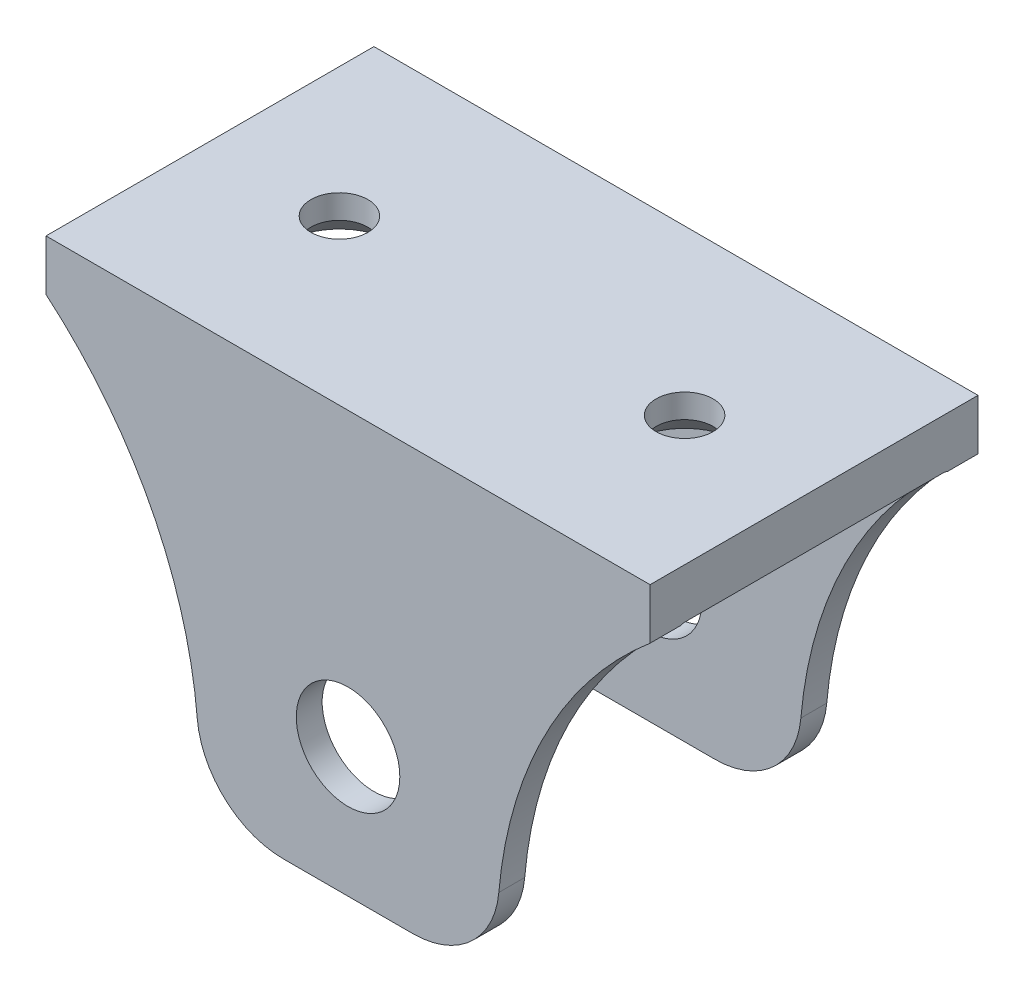
ISO-10303-21;
HEADER;
FILE_DESCRIPTION(('STEP AP214'),'2;1');
FILE_NAME('part.step','',(''),(''),'','','');
FILE_SCHEMA(('AUTOMOTIVE_DESIGN { 1 0 10303 214 1 1 1 1 }'));
ENDSEC;
DATA;
#1=APPLICATION_CONTEXT('core data for automotive mechanical design processes');
#2=APPLICATION_PROTOCOL_DEFINITION('international standard','automotive_design',2000,#1);
#3=PRODUCT_CONTEXT('',#1,'mechanical');
#4=PRODUCT('Part','Part','',(#3));
#5=PRODUCT_RELATED_PRODUCT_CATEGORY('part','',(#4));
#6=PRODUCT_DEFINITION_FORMATION('','',#4);
#7=PRODUCT_DEFINITION_CONTEXT('part definition',#1,'design');
#8=PRODUCT_DEFINITION('design','',#6,#7);
#9=PRODUCT_DEFINITION_SHAPE('','',#8);
#10=(LENGTH_UNIT() NAMED_UNIT(*) SI_UNIT(.MILLI.,.METRE.));
#11=(NAMED_UNIT(*) PLANE_ANGLE_UNIT() SI_UNIT($,.RADIAN.));
#12=(NAMED_UNIT(*) SI_UNIT($,.STERADIAN.) SOLID_ANGLE_UNIT());
#13=UNCERTAINTY_MEASURE_WITH_UNIT(LENGTH_MEASURE(1.E-05),#10,'distance_accuracy_value','');
#14=(GEOMETRIC_REPRESENTATION_CONTEXT(3) GLOBAL_UNCERTAINTY_ASSIGNED_CONTEXT((#13)) GLOBAL_UNIT_ASSIGNED_CONTEXT((#10,
#11,#12)) REPRESENTATION_CONTEXT('',''));
#15=CARTESIAN_POINT('',(0.,0.,0.));
#16=DIRECTION('',(0.,0.,1.));
#17=DIRECTION('',(1.,0.,0.));
#18=AXIS2_PLACEMENT_3D('',#15,#16,#17);
#19=CARTESIAN_POINT('',(-32.2779552679648,4.7069278027708,38.));
#20=DIRECTION('',(0.,0.,-1.));
#21=DIRECTION('',(-1.,0.,0.));
#22=AXIS2_PLACEMENT_3D('',#19,#20,#21);
#23=CYLINDRICAL_SURFACE('',#22,50.);
#24=DIRECTION('',(0.,0.,-1.));
#25=VECTOR('',#24,1.);
#26=CARTESIAN_POINT('',(0.,42.8924434300249,38.));
#27=LINE('',#26,#25);
#28=CARTESIAN_POINT('',(0.,42.8924434300249,38.));
#29=VERTEX_POINT('',#28);
#30=CARTESIAN_POINT('',(0.,42.8924434300249,34.4511593113363));
#31=VERTEX_POINT('',#30);
#32=EDGE_CURVE('E201',#29,#31,#27,.T.);
#33=ORIENTED_EDGE('',*,*,#32,.T.);
#34=CARTESIAN_POINT('',(0.,42.8924434300249,34.4511593113363));
#35=CARTESIAN_POINT('',(0.0165737755404564,42.8784340684061,34.4788576922844));
#36=CARTESIAN_POINT('',(0.0342804237961546,42.8634479296618,34.5053146071971));
#37=CARTESIAN_POINT('',(0.0715275687075985,42.8318743436861,34.555761443307));
#38=CARTESIAN_POINT('',(0.0910634553210315,42.8152909190579,34.579757263009));
#39=CARTESIAN_POINT('',(0.151456199566266,42.7639381509381,34.6477691653998));
#40=CARTESIAN_POINT('',(0.194478777004276,42.7272451192806,34.6884127674672));
#41=CARTESIAN_POINT('',(0.301753594752499,42.6354039331985,34.7756996312057));
#42=CARTESIAN_POINT('',(0.367726578397464,42.578651736762,34.8184694778107));
#43=CARTESIAN_POINT('',(0.504003930345722,42.4607537076925,34.8902249155182));
#44=CARTESIAN_POINT('',(0.574339239835926,42.399575812586,34.9190952240054));
#45=CARTESIAN_POINT('',(0.708788449071322,42.2819432439424,34.9612213949925));
#46=CARTESIAN_POINT('',(0.772695222897111,42.2257473422288,34.975884207073));
#47=CARTESIAN_POINT('',(0.868496783026503,42.1410633955054,34.9904070189195));
#48=CARTESIAN_POINT('',(0.900207937336673,42.1129605477587,34.9940030076944));
#49=CARTESIAN_POINT('',(0.963656182732306,42.0565873804818,34.9987974089236));
#50=CARTESIAN_POINT('',(0.995393270380941,42.0283170807641,34.9999960995532));
#51=CARTESIAN_POINT('',(1.02710089611114,42.,35.));
#52=B_SPLINE_CURVE_WITH_KNOTS('',3,(#34,#35,#36,#37,#38,#39,#40,#41,#42,#43,#44,#45,#46,#47,#48,
#49,#50,#51),.UNSPECIFIED.,.F.,.F.,(4,2,2,2,2,2,2,2,4),(0.,0.105424627320015,0.210590369885622,
0.418610866371283,0.708012924422764,0.999775608701713,1.25820941884816,1.38572347951947,
1.51322274297915),.UNSPECIFIED.);
#53=CARTESIAN_POINT('',(1.02710089611114,42.,35.));
#54=VERTEX_POINT('',#53);
#55=EDGE_CURVE('E218',#31,#54,#52,.T.);
#56=ORIENTED_EDGE('',*,*,#55,.T.);
#57=CARTESIAN_POINT('',(-32.2779552679648,4.7069278027708,35.));
#58=DIRECTION('',(0.,0.,1.));
#59=DIRECTION('',(1.,0.,0.));
#60=AXIS2_PLACEMENT_3D('',#57,#58,#59);
#61=CIRCLE('',#60,50.);
#62=CARTESIAN_POINT('',(17.5271049021829,9.1178213004618,35.));
#63=VERTEX_POINT('',#62);
#64=EDGE_CURVE('E288',#54,#63,#61,.F.);
#65=ORIENTED_EDGE('',*,*,#64,.T.);
#66=DIRECTION('',(0.,0.,-1.));
#67=VECTOR('',#66,1.);
#68=CARTESIAN_POINT('',(17.5271049021829,9.1178213004618,38.));
#69=LINE('',#68,#67);
#70=CARTESIAN_POINT('',(17.5271049021829,9.1178213004618,38.));
#71=VERTEX_POINT('',#70);
#72=EDGE_CURVE('E198',#71,#63,#69,.T.);
#73=ORIENTED_EDGE('',*,*,#72,.F.);
#74=CARTESIAN_POINT('',(-32.2779552679648,4.7069278027708,38.));
#75=DIRECTION('',(0.,0.,1.));
#76=DIRECTION('',(1.,0.,0.));
#77=AXIS2_PLACEMENT_3D('',#74,#75,#76);
#78=CIRCLE('',#77,50.);
#79=EDGE_CURVE('E272',#29,#71,#78,.F.);
#80=ORIENTED_EDGE('',*,*,#79,.F.);
#81=EDGE_LOOP('',(#33,#56,#65,#73,#80));
#82=FACE_BOUND('',#81,.T.);
#83=ADVANCED_FACE('F38',(#82),#23,.F.);
#84=CARTESIAN_POINT('',(27.4881169362124,10.,38.));
#85=DIRECTION('',(0.,0.,-1.));
#86=DIRECTION('',(-1.,0.,0.));
#87=AXIS2_PLACEMENT_3D('',#84,#85,#86);
#88=CYLINDRICAL_SURFACE('',#87,10.);
#89=CARTESIAN_POINT('',(27.4881169362124,10.,35.));
#90=DIRECTION('',(0.,0.,1.));
#91=DIRECTION('',(1.,0.,0.));
#92=AXIS2_PLACEMENT_3D('',#89,#90,#91);
#93=CIRCLE('',#92,10.);
#94=CARTESIAN_POINT('',(27.4881169362124,0.,35.));
#95=VERTEX_POINT('',#94);
#96=EDGE_CURVE('E298',#95,#63,#93,.F.);
#97=ORIENTED_EDGE('',*,*,#96,.F.);
#98=DIRECTION('',(0.,0.,-1.));
#99=VECTOR('',#98,1.);
#100=CARTESIAN_POINT('',(27.4881169362124,0.,38.));
#101=LINE('',#100,#99);
#102=CARTESIAN_POINT('',(27.4881169362124,0.,38.));
#103=VERTEX_POINT('',#102);
#104=EDGE_CURVE('E189',#103,#95,#101,.T.);
#105=ORIENTED_EDGE('',*,*,#104,.F.);
#106=CARTESIAN_POINT('',(27.4881169362124,10.,38.));
#107=DIRECTION('',(0.,0.,1.));
#108=DIRECTION('',(1.,0.,0.));
#109=AXIS2_PLACEMENT_3D('',#106,#107,#108);
#110=CIRCLE('',#109,10.);
#111=EDGE_CURVE('E317',#103,#71,#110,.F.);
#112=ORIENTED_EDGE('',*,*,#111,.T.);
#113=ORIENTED_EDGE('',*,*,#72,.T.);
#114=EDGE_LOOP('',(#97,#105,#112,#113));
#115=FACE_BOUND('',#114,.T.);
#116=ADVANCED_FACE('F261',(#115),#88,.T.);
#117=CARTESIAN_POINT('',(0.,0.,38.));
#118=DIRECTION('',(0.,1.,0.));
#119=DIRECTION('',(0.,0.,1.));
#120=AXIS2_PLACEMENT_3D('',#117,#118,#119);
#121=PLANE('',#120);
#122=ORIENTED_EDGE('',*,*,#104,.T.);
#123=DIRECTION('',(-1.,0.,0.));
#124=VECTOR('',#123,1.);
#125=CARTESIAN_POINT('',(0.,0.,35.));
#126=LINE('',#125,#124);
#127=CARTESIAN_POINT('',(42.5118830637876,0.,35.));
#128=VERTEX_POINT('',#127);
#129=EDGE_CURVE('E182',#128,#95,#126,.T.);
#130=ORIENTED_EDGE('',*,*,#129,.F.);
#131=DIRECTION('',(0.,0.,-1.));
#132=VECTOR('',#131,1.);
#133=CARTESIAN_POINT('',(42.5118830637876,0.,38.));
#134=LINE('',#133,#132);
#135=CARTESIAN_POINT('',(42.5118830637876,0.,38.));
#136=VERTEX_POINT('',#135);
#137=EDGE_CURVE('E190',#136,#128,#134,.T.);
#138=ORIENTED_EDGE('',*,*,#137,.F.);
#139=DIRECTION('',(1.,0.,0.));
#140=VECTOR('',#139,1.);
#141=CARTESIAN_POINT('',(0.,0.,38.));
#142=LINE('',#141,#140);
#143=EDGE_CURVE('E320',#103,#136,#142,.T.);
#144=ORIENTED_EDGE('',*,*,#143,.F.);
#145=EDGE_LOOP('',(#122,#130,#138,#144));
#146=FACE_BOUND('',#145,.T.);
#147=ADVANCED_FACE('F266',(#146),#121,.F.);
#148=CARTESIAN_POINT('',(42.5118830637876,10.,38.));
#149=DIRECTION('',(0.,0.,-1.));
#150=DIRECTION('',(-1.,0.,0.));
#151=AXIS2_PLACEMENT_3D('',#148,#149,#150);
#152=CYLINDRICAL_SURFACE('',#151,10.);
#153=ORIENTED_EDGE('',*,*,#137,.T.);
#154=CARTESIAN_POINT('',(42.5118830637876,10.,35.));
#155=DIRECTION('',(0.,0.,1.));
#156=DIRECTION('',(1.,0.,0.));
#157=AXIS2_PLACEMENT_3D('',#154,#155,#156);
#158=CIRCLE('',#157,10.);
#159=CARTESIAN_POINT('',(52.4728950978171,9.1178213004618,35.));
#160=VERTEX_POINT('',#159);
#161=EDGE_CURVE('E295',#128,#160,#158,.T.);
#162=ORIENTED_EDGE('',*,*,#161,.T.);
#163=DIRECTION('',(0.,0.,-1.));
#164=VECTOR('',#163,1.);
#165=CARTESIAN_POINT('',(52.4728950978171,9.1178213004618,38.));
#166=LINE('',#165,#164);
#167=CARTESIAN_POINT('',(52.4728950978171,9.1178213004618,38.));
#168=VERTEX_POINT('',#167);
#169=EDGE_CURVE('E294',#168,#160,#166,.T.);
#170=ORIENTED_EDGE('',*,*,#169,.F.);
#171=CARTESIAN_POINT('',(42.5118830637876,10.,38.));
#172=DIRECTION('',(0.,0.,1.));
#173=DIRECTION('',(1.,0.,0.));
#174=AXIS2_PLACEMENT_3D('',#171,#172,#173);
#175=CIRCLE('',#174,10.);
#176=EDGE_CURVE('E323',#136,#168,#175,.T.);
#177=ORIENTED_EDGE('',*,*,#176,.F.);
#178=EDGE_LOOP('',(#153,#162,#170,#177));
#179=FACE_BOUND('',#178,.T.);
#180=ADVANCED_FACE('F397',(#179),#152,.T.);
#181=CARTESIAN_POINT('',(102.277955267965,4.70692780277081,38.));
#182=DIRECTION('',(0.,0.,-1.));
#183=DIRECTION('',(-1.,0.,0.));
#184=AXIS2_PLACEMENT_3D('',#181,#182,#183);
#185=CYLINDRICAL_SURFACE('',#184,50.);
#186=CARTESIAN_POINT('',(102.277955267965,4.70692780277081,35.));
#187=DIRECTION('',(0.,0.,1.));
#188=DIRECTION('',(1.,0.,0.));
#189=AXIS2_PLACEMENT_3D('',#186,#187,#188);
#190=CIRCLE('',#189,50.);
#191=CARTESIAN_POINT('',(68.9728991038889,42.,35.));
#192=VERTEX_POINT('',#191);
#193=EDGE_CURVE('E285',#192,#160,#190,.T.);
#194=ORIENTED_EDGE('',*,*,#193,.F.);
#195=CARTESIAN_POINT('',(68.9728991038889,42.,35.));
#196=CARTESIAN_POINT('',(69.0189328627661,42.0411125246596,34.9999822866833));
#197=CARTESIAN_POINT('',(69.0650482729012,42.0821418144975,34.9974636533273));
#198=CARTESIAN_POINT('',(69.1571944097174,42.1638226016345,34.9873541076251));
#199=CARTESIAN_POINT('',(69.2032248651741,42.2044733510247,34.9797547063408));
#200=CARTESIAN_POINT('',(69.2956668569454,42.2858117580748,34.9592195203912));
#201=CARTESIAN_POINT('',(69.342069010497,42.3264854351228,34.9461850645673));
#202=CARTESIAN_POINT('',(69.4339040569988,42.4066892502752,34.9145822186454));
#203=CARTESIAN_POINT('',(69.4793377200552,42.4462203065861,34.8960184156655));
#204=CARTESIAN_POINT('',(69.5792232218089,42.5328216169678,34.8479959253264));
#205=CARTESIAN_POINT('',(69.6332996518212,42.57949336418,34.817004694615));
#206=CARTESIAN_POINT('',(69.737396348496,42.6689704785598,34.7454735548813));
#207=CARTESIAN_POINT('',(69.7874474758785,42.7118056224167,34.7050179831085));
#208=CARTESIAN_POINT('',(69.8651785822598,42.7780917740498,34.6293968752963));
#209=CARTESIAN_POINT('',(69.894552815272,42.8030762540724,34.5973436014197));
#210=CARTESIAN_POINT('',(69.9500605045597,42.8501918179988,34.5281361141865));
#211=CARTESIAN_POINT('',(69.9761654788963,42.8722978833158,34.4909423114399));
#212=CARTESIAN_POINT('',(70.,42.8924434300249,34.4511593113363));
#213=B_SPLINE_CURVE_WITH_KNOTS('',3,(#195,#196,#197,#198,#199,#200,#201,#202,#203,#204,#205,
#206,#207,#208,#209,#210,#211,#212),.UNSPECIFIED.,.F.,.F.,(4,2,2,2,2,2,2,2,4),(0.,
0.185117557812076,0.370545185233216,0.559496791985733,0.748292079981396,0.981233006295467,
1.21217233881067,1.36220305705791,1.51346130414057),.UNSPECIFIED.);
#214=CARTESIAN_POINT('',(70.,42.8924434300249,34.4511593113363));
#215=VERTEX_POINT('',#214);
#216=EDGE_CURVE('E225',#192,#215,#213,.T.);
#217=ORIENTED_EDGE('',*,*,#216,.T.);
#218=DIRECTION('',(0.,0.,-1.));
#219=VECTOR('',#218,1.);
#220=CARTESIAN_POINT('',(70.,42.8924434300249,38.));
#221=LINE('',#220,#219);
#222=CARTESIAN_POINT('',(70.,42.8924434300249,38.));
#223=VERTEX_POINT('',#222);
#224=EDGE_CURVE('E352',#223,#215,#221,.T.);
#225=ORIENTED_EDGE('',*,*,#224,.F.);
#226=CARTESIAN_POINT('',(102.277955267965,4.70692780277081,38.));
#227=DIRECTION('',(0.,0.,1.));
#228=DIRECTION('',(1.,0.,0.));
#229=AXIS2_PLACEMENT_3D('',#226,#227,#228);
#230=CIRCLE('',#229,50.);
#231=EDGE_CURVE('E325',#223,#168,#230,.T.);
#232=ORIENTED_EDGE('',*,*,#231,.T.);
#233=ORIENTED_EDGE('',*,*,#169,.T.);
#234=EDGE_LOOP('',(#194,#217,#225,#232,#233));
#235=FACE_BOUND('',#234,.T.);
#236=ADVANCED_FACE('F291',(#235),#185,.F.);
#237=CARTESIAN_POINT('',(35.,15.,38.));
#238=DIRECTION('',(0.,0.,-1.));
#239=DIRECTION('',(-1.,0.,0.));
#240=AXIS2_PLACEMENT_3D('',#237,#238,#239);
#241=CYLINDRICAL_SURFACE('',#240,5.99999999999999);
#242=CARTESIAN_POINT('',(35.,15.,35.));
#243=DIRECTION('',(0.,0.,1.));
#244=DIRECTION('',(1.,0.,0.));
#245=AXIS2_PLACEMENT_3D('',#242,#243,#244);
#246=CIRCLE('',#245,5.99999999999999);
#247=CARTESIAN_POINT('',(41.,15.,35.));
#248=VERTEX_POINT('',#247);
#249=EDGE_CURVE('E296',#248,#248,#246,.T.);
#250=ORIENTED_EDGE('',*,*,#249,.F.);
#251=EDGE_LOOP('',(#250));
#252=FACE_BOUND('',#251,.T.);
#253=CARTESIAN_POINT('',(35.,15.,38.));
#254=DIRECTION('',(0.,0.,1.));
#255=DIRECTION('',(1.,0.,0.));
#256=AXIS2_PLACEMENT_3D('',#253,#254,#255);
#257=CIRCLE('',#256,5.99999999999999);
#258=CARTESIAN_POINT('',(41.,15.,38.));
#259=VERTEX_POINT('',#258);
#260=EDGE_CURVE('E307',#259,#259,#257,.T.);
#261=ORIENTED_EDGE('',*,*,#260,.T.);
#262=EDGE_LOOP('',(#261));
#263=FACE_BOUND('',#262,.T.);
#264=ADVANCED_FACE('F249',(#252,#263),#241,.F.);
#265=CARTESIAN_POINT('',(0.,48.7686408812628,38.));
#266=DIRECTION('',(0.,1.,0.));
#267=DIRECTION('',(-1.,0.,0.));
#268=AXIS2_PLACEMENT_3D('',#265,#266,#267);
#269=PLANE('',#268);
#270=CARTESIAN_POINT('',(15.,48.7686408812628,19.));
#271=DIRECTION('',(0.,-1.,0.));
#272=DIRECTION('',(0.,0.,-1.));
#273=AXIS2_PLACEMENT_3D('',#270,#271,#272);
#274=CIRCLE('',#273,3.3);
#275=CARTESIAN_POINT('',(15.,48.7686408812628,15.7));
#276=VERTEX_POINT('',#275);
#277=EDGE_CURVE('E634',#276,#276,#274,.T.);
#278=ORIENTED_EDGE('',*,*,#277,.T.);
#279=EDGE_LOOP('',(#278));
#280=FACE_BOUND('',#279,.T.);
#281=CARTESIAN_POINT('',(55.,48.7686408812628,18.9999987775148));
#282=DIRECTION('',(0.,-1.,0.));
#283=DIRECTION('',(0.,0.,-1.));
#284=AXIS2_PLACEMENT_3D('',#281,#282,#283);
#285=CIRCLE('',#284,3.3);
#286=CARTESIAN_POINT('',(55.,48.7686408812628,15.6999987775148));
#287=VERTEX_POINT('',#286);
#288=EDGE_CURVE('E183',#287,#287,#285,.T.);
#289=ORIENTED_EDGE('',*,*,#288,.T.);
#290=EDGE_LOOP('',(#289));
#291=FACE_BOUND('',#290,.T.);
#292=DIRECTION('',(1.,0.,0.));
#293=VECTOR('',#292,1.);
#294=CARTESIAN_POINT('',(0.,48.7686408812628,0.));
#295=LINE('',#294,#293);
#296=CARTESIAN_POINT('',(0.,48.7686408812628,0.));
#297=VERTEX_POINT('',#296);
#298=CARTESIAN_POINT('',(70.,48.7686408812628,0.));
#299=VERTEX_POINT('',#298);
#300=EDGE_CURVE('E332',#297,#299,#295,.T.);
#301=ORIENTED_EDGE('',*,*,#300,.F.);
#302=DIRECTION('',(0.,0.,-1.));
#303=VECTOR('',#302,1.);
#304=CARTESIAN_POINT('',(0.,48.7686408812628,38.));
#305=LINE('',#304,#303);
#306=CARTESIAN_POINT('',(0.,48.7686408812628,38.));
#307=VERTEX_POINT('',#306);
#308=EDGE_CURVE('E203',#307,#297,#305,.T.);
#309=ORIENTED_EDGE('',*,*,#308,.F.);
#310=DIRECTION('',(1.,0.,0.));
#311=VECTOR('',#310,1.);
#312=CARTESIAN_POINT('',(0.,48.7686408812628,38.));
#313=LINE('',#312,#311);
#314=CARTESIAN_POINT('',(70.,48.7686408812628,38.));
#315=VERTEX_POINT('',#314);
#316=EDGE_CURVE('E310',#307,#315,#313,.T.);
#317=ORIENTED_EDGE('',*,*,#316,.T.);
#318=DIRECTION('',(0.,0.,-1.));
#319=VECTOR('',#318,1.);
#320=CARTESIAN_POINT('',(70.,48.7686408812628,38.));
#321=LINE('',#320,#319);
#322=EDGE_CURVE('E329',#315,#299,#321,.T.);
#323=ORIENTED_EDGE('',*,*,#322,.T.);
#324=EDGE_LOOP('',(#301,#309,#317,#323));
#325=FACE_BOUND('',#324,.T.);
#326=ADVANCED_FACE('F250',(#280,#291,#325),#269,.T.);
#327=CARTESIAN_POINT('',(0.,0.,38.));
#328=DIRECTION('',(1.,0.,0.));
#329=DIRECTION('',(0.,0.,-1.));
#330=AXIS2_PLACEMENT_3D('',#327,#328,#329);
#331=PLANE('',#330);
#332=DIRECTION('',(0.,0.,-1.));
#333=VECTOR('',#332,1.);
#334=CARTESIAN_POINT('',(0.,43.,35.));
#335=LINE('',#334,#333);
#336=CARTESIAN_POINT('',(0.,43.,34.));
#337=VERTEX_POINT('',#336);
#338=CARTESIAN_POINT('',(0.,43.,4.));
#339=VERTEX_POINT('',#338);
#340=EDGE_CURVE('E276',#337,#339,#335,.T.);
#341=ORIENTED_EDGE('',*,*,#340,.F.);
#342=CARTESIAN_POINT('',(0.,42.,34.));
#343=DIRECTION('',(1.,0.,0.));
#344=DIRECTION('',(0.,0.,-1.));
#345=AXIS2_PLACEMENT_3D('',#342,#343,#344);
#346=CIRCLE('',#345,1.);
#347=EDGE_CURVE('E215',#337,#31,#346,.T.);
#348=ORIENTED_EDGE('',*,*,#347,.T.);
#349=ORIENTED_EDGE('',*,*,#32,.F.);
#350=DIRECTION('',(0.,-1.,0.));
#351=VECTOR('',#350,1.);
#352=CARTESIAN_POINT('',(0.,0.,38.));
#353=LINE('',#352,#351);
#354=EDGE_CURVE('E314',#307,#29,#353,.T.);
#355=ORIENTED_EDGE('',*,*,#354,.F.);
#356=ORIENTED_EDGE('',*,*,#308,.T.);
#357=DIRECTION('',(0.,-1.,0.));
#358=VECTOR('',#357,1.);
#359=CARTESIAN_POINT('',(0.,0.,0.));
#360=LINE('',#359,#358);
#361=CARTESIAN_POINT('',(0.,42.8924434300249,0.));
#362=VERTEX_POINT('',#361);
#363=EDGE_CURVE('E335',#297,#362,#360,.T.);
#364=ORIENTED_EDGE('',*,*,#363,.T.);
#365=CARTESIAN_POINT('',(0.,42.8924434300249,3.54884068866371));
#366=VERTEX_POINT('',#365);
#367=EDGE_CURVE('E53',#366,#362,#27,.T.);
#368=ORIENTED_EDGE('',*,*,#367,.F.);
#369=CARTESIAN_POINT('',(0.,42.,4.));
#370=DIRECTION('',(1.,0.,0.));
#371=DIRECTION('',(0.,0.,-1.));
#372=AXIS2_PLACEMENT_3D('',#369,#370,#371);
#373=CIRCLE('',#372,1.);
#374=EDGE_CURVE('E11',#366,#339,#373,.T.);
#375=ORIENTED_EDGE('',*,*,#374,.T.);
#376=EDGE_LOOP('',(#341,#348,#349,#355,#356,#364,#368,#375));
#377=FACE_BOUND('',#376,.T.);
#378=ADVANCED_FACE('F252',(#377),#331,.F.);
#379=CARTESIAN_POINT('',(17.5271049021829,9.1178213004618,3.));
#380=VERTEX_POINT('',#379);
#381=CARTESIAN_POINT('',(17.5271049021829,9.1178213004618,0.));
#382=VERTEX_POINT('',#381);
#383=EDGE_CURVE('E193',#380,#382,#69,.T.);
#384=ORIENTED_EDGE('',*,*,#383,.F.);
#385=CARTESIAN_POINT('',(-32.2779552679648,4.7069278027708,3.));
#386=DIRECTION('',(0.,0.,-1.));
#387=DIRECTION('',(-1.,0.,0.));
#388=AXIS2_PLACEMENT_3D('',#385,#386,#387);
#389=CIRCLE('',#388,50.);
#390=CARTESIAN_POINT('',(1.02710089611114,42.,3.));
#391=VERTEX_POINT('',#390);
#392=EDGE_CURVE('E169',#380,#391,#389,.F.);
#393=ORIENTED_EDGE('',*,*,#392,.T.);
#394=CARTESIAN_POINT('',(1.02710089611114,42.,3.));
#395=CARTESIAN_POINT('',(0.981067137233923,42.0411125246596,3.00001771331666));
#396=CARTESIAN_POINT('',(0.934951727098803,42.0821418144975,3.00253634667266));
#397=CARTESIAN_POINT('',(0.842805590282605,42.1638226016345,3.0126458923749));
#398=CARTESIAN_POINT('',(0.796775134825887,42.2044733510247,3.0202452936592));
#399=CARTESIAN_POINT('',(0.704333143054651,42.2858117580748,3.04078047960884));
#400=CARTESIAN_POINT('',(0.657930989503031,42.3264854351228,3.05381493543268));
#401=CARTESIAN_POINT('',(0.566095943001213,42.4066892502752,3.08541778135464));
#402=CARTESIAN_POINT('',(0.520662279944813,42.4462203065861,3.10398158433451));
#403=CARTESIAN_POINT('',(0.420776778191104,42.5328216169678,3.15200407467357));
#404=CARTESIAN_POINT('',(0.366700348178826,42.5794933641801,3.18299530538497));
#405=CARTESIAN_POINT('',(0.262603651503957,42.6689704785598,3.25452644511872));
#406=CARTESIAN_POINT('',(0.212552524121469,42.7118056224167,3.29498201689153));
#407=CARTESIAN_POINT('',(0.1348214177402,42.7780917740498,3.37060312470374));
#408=CARTESIAN_POINT('',(0.105447184728025,42.8030762540724,3.40265639858032));
#409=CARTESIAN_POINT('',(0.04993949544036,42.8501918179988,3.47186388581346));
#410=CARTESIAN_POINT('',(0.0238345211036655,42.8722978833158,3.50905768856007));
#411=CARTESIAN_POINT('',(0.,42.8924434300249,3.54884068866372));
#412=B_SPLINE_CURVE_WITH_KNOTS('',3,(#394,#395,#396,#397,#398,#399,#400,#401,#402,#403,#404,
#405,#406,#407,#408,#409,#410,#411),.UNSPECIFIED.,.F.,.F.,(4,2,2,2,2,2,2,2,4),(0.,
0.185117557812075,0.370545185233218,0.559496791985744,0.748292079981425,0.981233006295486,
1.21217233881069,1.3622030570579,1.51346130414055),.UNSPECIFIED.);
#413=EDGE_CURVE('E47',#391,#366,#412,.T.);
#414=ORIENTED_EDGE('',*,*,#413,.T.);
#415=ORIENTED_EDGE('',*,*,#367,.T.);
#416=CARTESIAN_POINT('',(-32.2779552679648,4.7069278027708,0.));
#417=DIRECTION('',(0.,0.,1.));
#418=DIRECTION('',(1.,0.,0.));
#419=AXIS2_PLACEMENT_3D('',#416,#417,#418);
#420=CIRCLE('',#419,50.);
#421=EDGE_CURVE('E337',#362,#382,#420,.F.);
#422=ORIENTED_EDGE('',*,*,#421,.T.);
#423=EDGE_LOOP('',(#384,#393,#414,#415,#422));
#424=FACE_BOUND('',#423,.T.);
#425=ADVANCED_FACE('F232',(#424),#23,.F.);
#426=CARTESIAN_POINT('',(27.4881169362124,10.,3.));
#427=DIRECTION('',(0.,0.,-1.));
#428=DIRECTION('',(-1.,0.,0.));
#429=AXIS2_PLACEMENT_3D('',#426,#427,#428);
#430=CIRCLE('',#429,10.);
#431=CARTESIAN_POINT('',(27.4881169362124,0.,3.));
#432=VERTEX_POINT('',#431);
#433=EDGE_CURVE('E162',#380,#432,#430,.F.);
#434=ORIENTED_EDGE('',*,*,#433,.F.);
#435=ORIENTED_EDGE('',*,*,#383,.T.);
#436=CARTESIAN_POINT('',(27.4881169362124,10.,0.));
#437=DIRECTION('',(0.,0.,1.));
#438=DIRECTION('',(1.,0.,0.));
#439=AXIS2_PLACEMENT_3D('',#436,#437,#438);
#440=CIRCLE('',#439,10.);
#441=CARTESIAN_POINT('',(27.4881169362124,0.,0.));
#442=VERTEX_POINT('',#441);
#443=EDGE_CURVE('E188',#442,#382,#440,.F.);
#444=ORIENTED_EDGE('',*,*,#443,.F.);
#445=EDGE_CURVE('E179',#432,#442,#101,.T.);
#446=ORIENTED_EDGE('',*,*,#445,.F.);
#447=EDGE_LOOP('',(#434,#435,#444,#446));
#448=FACE_BOUND('',#447,.T.);
#449=ADVANCED_FACE('F186',(#448),#88,.T.);
#450=CARTESIAN_POINT('',(42.5118830637876,0.,3.));
#451=VERTEX_POINT('',#450);
#452=CARTESIAN_POINT('',(42.5118830637876,0.,0.));
#453=VERTEX_POINT('',#452);
#454=EDGE_CURVE('E181',#451,#453,#134,.T.);
#455=ORIENTED_EDGE('',*,*,#454,.F.);
#456=DIRECTION('',(1.,0.,0.));
#457=VECTOR('',#456,1.);
#458=CARTESIAN_POINT('',(0.,0.,3.));
#459=LINE('',#458,#457);
#460=EDGE_CURVE('E166',#432,#451,#459,.T.);
#461=ORIENTED_EDGE('',*,*,#460,.F.);
#462=ORIENTED_EDGE('',*,*,#445,.T.);
#463=DIRECTION('',(1.,0.,0.));
#464=VECTOR('',#463,1.);
#465=CARTESIAN_POINT('',(0.,0.,0.));
#466=LINE('',#465,#464);
#467=EDGE_CURVE('E341',#442,#453,#466,.T.);
#468=ORIENTED_EDGE('',*,*,#467,.T.);
#469=EDGE_LOOP('',(#455,#461,#462,#468));
#470=FACE_BOUND('',#469,.T.);
#471=ADVANCED_FACE('F177',(#470),#121,.F.);
#472=CARTESIAN_POINT('',(52.4728950978171,9.1178213004618,3.));
#473=VERTEX_POINT('',#472);
#474=CARTESIAN_POINT('',(52.4728950978171,9.1178213004618,0.));
#475=VERTEX_POINT('',#474);
#476=EDGE_CURVE('E353',#473,#475,#166,.T.);
#477=ORIENTED_EDGE('',*,*,#476,.F.);
#478=CARTESIAN_POINT('',(42.5118830637876,10.,3.));
#479=DIRECTION('',(0.,0.,-1.));
#480=DIRECTION('',(-1.,0.,0.));
#481=AXIS2_PLACEMENT_3D('',#478,#479,#480);
#482=CIRCLE('',#481,10.);
#483=EDGE_CURVE('E173',#473,#451,#482,.T.);
#484=ORIENTED_EDGE('',*,*,#483,.T.);
#485=ORIENTED_EDGE('',*,*,#454,.T.);
#486=CARTESIAN_POINT('',(42.5118830637876,10.,0.));
#487=DIRECTION('',(0.,0.,1.));
#488=DIRECTION('',(1.,0.,0.));
#489=AXIS2_PLACEMENT_3D('',#486,#487,#488);
#490=CIRCLE('',#489,10.);
#491=EDGE_CURVE('E343',#453,#475,#490,.T.);
#492=ORIENTED_EDGE('',*,*,#491,.T.);
#493=EDGE_LOOP('',(#477,#484,#485,#492));
#494=FACE_BOUND('',#493,.T.);
#495=ADVANCED_FACE('F359',(#494),#152,.T.);
#496=CARTESIAN_POINT('',(102.277955267965,4.70692780277081,3.));
#497=DIRECTION('',(0.,0.,-1.));
#498=DIRECTION('',(-1.,0.,0.));
#499=AXIS2_PLACEMENT_3D('',#496,#497,#498);
#500=CIRCLE('',#499,50.);
#501=CARTESIAN_POINT('',(68.9728991038889,42.,3.));
#502=VERTEX_POINT('',#501);
#503=EDGE_CURVE('E356',#473,#502,#500,.T.);
#504=ORIENTED_EDGE('',*,*,#503,.F.);
#505=ORIENTED_EDGE('',*,*,#476,.T.);
#506=CARTESIAN_POINT('',(102.277955267965,4.70692780277081,0.));
#507=DIRECTION('',(0.,0.,1.));
#508=DIRECTION('',(1.,0.,0.));
#509=AXIS2_PLACEMENT_3D('',#506,#507,#508);
#510=CIRCLE('',#509,50.);
#511=CARTESIAN_POINT('',(70.,42.8924434300249,0.));
#512=VERTEX_POINT('',#511);
#513=EDGE_CURVE('E346',#512,#475,#510,.T.);
#514=ORIENTED_EDGE('',*,*,#513,.F.);
#515=CARTESIAN_POINT('',(70.,42.8924434300249,3.54884068866373));
#516=VERTEX_POINT('',#515);
#517=EDGE_CURVE('E61',#516,#512,#221,.T.);
#518=ORIENTED_EDGE('',*,*,#517,.F.);
#519=CARTESIAN_POINT('',(70.,42.8924434300249,3.54884068866373));
#520=CARTESIAN_POINT('',(69.9834262244595,42.8784340684061,3.52114230771565));
#521=CARTESIAN_POINT('',(69.9657195762039,42.8634479296618,3.49468539280289));
#522=CARTESIAN_POINT('',(69.9284724312924,42.8318743436861,3.444238556693));
#523=CARTESIAN_POINT('',(69.908936544679,42.8152909190579,3.42024273699098));
#524=CARTESIAN_POINT('',(69.8485438004338,42.7639381509381,3.35223083460017));
#525=CARTESIAN_POINT('',(69.8055212229957,42.7272451192806,3.3115872325328));
#526=CARTESIAN_POINT('',(69.6982464052475,42.6354039331985,3.2243003687943));
#527=CARTESIAN_POINT('',(69.6322734216026,42.578651736762,3.18153052218928));
#528=CARTESIAN_POINT('',(69.4959960696543,42.4607537076926,3.10977508448178));
#529=CARTESIAN_POINT('',(69.4256607601641,42.399575812586,3.08090477599462));
#530=CARTESIAN_POINT('',(69.2912115509287,42.2819432439425,3.03877860500747));
#531=CARTESIAN_POINT('',(69.2273047771029,42.2257473422288,3.02411579292705));
#532=CARTESIAN_POINT('',(69.1315032169735,42.1410633955054,3.00959298108049));
#533=CARTESIAN_POINT('',(69.0997920626633,42.1129605477587,3.00599699230556));
#534=CARTESIAN_POINT('',(69.0363438172677,42.0565873804818,3.00120259107641));
#535=CARTESIAN_POINT('',(69.0046067296191,42.0283170807641,3.00000390044683));
#536=CARTESIAN_POINT('',(68.9728991038889,42.,3.));
#537=B_SPLINE_CURVE_WITH_KNOTS('',3,(#519,#520,#521,#522,#523,#524,#525,#526,#527,#528,#529,
#530,#531,#532,#533,#534,#535,#536),.UNSPECIFIED.,.F.,.F.,(4,2,2,2,2,2,2,2,4),(0.,
0.105424627320015,0.210590369885613,0.418610866371275,0.708012924422747,0.999775608701692,
1.25820941884816,1.38572347951949,1.51322274297918),.UNSPECIFIED.);
#538=EDGE_CURVE('E375',#516,#502,#537,.T.);
#539=ORIENTED_EDGE('',*,*,#538,.T.);
#540=EDGE_LOOP('',(#504,#505,#514,#518,#539));
#541=FACE_BOUND('',#540,.T.);
#542=ADVANCED_FACE('F247',(#541),#185,.F.);
#543=CARTESIAN_POINT('',(35.,15.,3.));
#544=DIRECTION('',(0.,0.,-1.));
#545=DIRECTION('',(-1.,0.,0.));
#546=AXIS2_PLACEMENT_3D('',#543,#544,#545);
#547=CIRCLE('',#546,5.99999999999999);
#548=CARTESIAN_POINT('',(29.,15.,3.));
#549=VERTEX_POINT('',#548);
#550=EDGE_CURVE('E615',#549,#549,#547,.T.);
#551=ORIENTED_EDGE('',*,*,#550,.F.);
#552=EDGE_LOOP('',(#551));
#553=FACE_BOUND('',#552,.T.);
#554=CARTESIAN_POINT('',(35.,15.,0.));
#555=DIRECTION('',(0.,0.,1.));
#556=DIRECTION('',(1.,0.,0.));
#557=AXIS2_PLACEMENT_3D('',#554,#555,#556);
#558=CIRCLE('',#557,5.99999999999999);
#559=CARTESIAN_POINT('',(41.,15.,0.));
#560=VERTEX_POINT('',#559);
#561=EDGE_CURVE('E306',#560,#560,#558,.T.);
#562=ORIENTED_EDGE('',*,*,#561,.F.);
#563=EDGE_LOOP('',(#562));
#564=FACE_BOUND('',#563,.T.);
#565=ADVANCED_FACE('F242',(#553,#564),#241,.F.);
#566=CARTESIAN_POINT('',(70.,0.,38.));
#567=DIRECTION('',(-1.,0.,0.));
#568=DIRECTION('',(0.,0.,1.));
#569=AXIS2_PLACEMENT_3D('',#566,#567,#568);
#570=PLANE('',#569);
#571=ORIENTED_EDGE('',*,*,#224,.T.);
#572=CARTESIAN_POINT('',(70.,42.,34.));
#573=DIRECTION('',(-1.,0.,0.));
#574=DIRECTION('',(0.,0.,1.));
#575=AXIS2_PLACEMENT_3D('',#572,#573,#574);
#576=CIRCLE('',#575,1.);
#577=CARTESIAN_POINT('',(70.,43.,34.));
#578=VERTEX_POINT('',#577);
#579=EDGE_CURVE('E376',#215,#578,#576,.T.);
#580=ORIENTED_EDGE('',*,*,#579,.T.);
#581=DIRECTION('',(0.,0.,1.));
#582=VECTOR('',#581,1.);
#583=CARTESIAN_POINT('',(70.,43.,35.));
#584=LINE('',#583,#582);
#585=CARTESIAN_POINT('',(70.,43.,4.));
#586=VERTEX_POINT('',#585);
#587=EDGE_CURVE('E372',#586,#578,#584,.T.);
#588=ORIENTED_EDGE('',*,*,#587,.F.);
#589=CARTESIAN_POINT('',(70.,42.,4.));
#590=DIRECTION('',(-1.,0.,0.));
#591=DIRECTION('',(0.,0.,1.));
#592=AXIS2_PLACEMENT_3D('',#589,#590,#591);
#593=CIRCLE('',#592,1.);
#594=EDGE_CURVE('E369',#586,#516,#593,.T.);
#595=ORIENTED_EDGE('',*,*,#594,.T.);
#596=ORIENTED_EDGE('',*,*,#517,.T.);
#597=DIRECTION('',(0.,1.,0.));
#598=VECTOR('',#597,1.);
#599=CARTESIAN_POINT('',(70.,0.,0.));
#600=LINE('',#599,#598);
#601=EDGE_CURVE('E311',#512,#299,#600,.T.);
#602=ORIENTED_EDGE('',*,*,#601,.T.);
#603=ORIENTED_EDGE('',*,*,#322,.F.);
#604=DIRECTION('',(0.,1.,0.));
#605=VECTOR('',#604,1.);
#606=CARTESIAN_POINT('',(70.,0.,38.));
#607=LINE('',#606,#605);
#608=EDGE_CURVE('E327',#223,#315,#607,.T.);
#609=ORIENTED_EDGE('',*,*,#608,.F.);
#610=EDGE_LOOP('',(#571,#580,#588,#595,#596,#602,#603,#609));
#611=FACE_BOUND('',#610,.T.);
#612=ADVANCED_FACE('F246',(#611),#570,.F.);
#613=CARTESIAN_POINT('',(0.,0.,38.));
#614=DIRECTION('',(0.,0.,1.));
#615=DIRECTION('',(1.,0.,0.));
#616=AXIS2_PLACEMENT_3D('',#613,#614,#615);
#617=PLANE('',#616);
#618=ORIENTED_EDGE('',*,*,#260,.F.);
#619=EDGE_LOOP('',(#618));
#620=FACE_BOUND('',#619,.T.);
#621=ORIENTED_EDGE('',*,*,#316,.F.);
#622=ORIENTED_EDGE('',*,*,#354,.T.);
#623=ORIENTED_EDGE('',*,*,#79,.T.);
#624=ORIENTED_EDGE('',*,*,#111,.F.);
#625=ORIENTED_EDGE('',*,*,#143,.T.);
#626=ORIENTED_EDGE('',*,*,#176,.T.);
#627=ORIENTED_EDGE('',*,*,#231,.F.);
#628=ORIENTED_EDGE('',*,*,#608,.T.);
#629=EDGE_LOOP('',(#621,#622,#623,#624,#625,#626,#627,#628));
#630=FACE_BOUND('',#629,.T.);
#631=ADVANCED_FACE('F427',(#620,#630),#617,.T.);
#632=CARTESIAN_POINT('',(0.,0.,0.));
#633=DIRECTION('',(0.,0.,1.));
#634=DIRECTION('',(1.,0.,0.));
#635=AXIS2_PLACEMENT_3D('',#632,#633,#634);
#636=PLANE('',#635);
#637=ORIENTED_EDGE('',*,*,#561,.T.);
#638=EDGE_LOOP('',(#637));
#639=FACE_BOUND('',#638,.T.);
#640=ORIENTED_EDGE('',*,*,#300,.T.);
#641=ORIENTED_EDGE('',*,*,#601,.F.);
#642=ORIENTED_EDGE('',*,*,#513,.T.);
#643=ORIENTED_EDGE('',*,*,#491,.F.);
#644=ORIENTED_EDGE('',*,*,#467,.F.);
#645=ORIENTED_EDGE('',*,*,#443,.T.);
#646=ORIENTED_EDGE('',*,*,#421,.F.);
#647=ORIENTED_EDGE('',*,*,#363,.F.);
#648=EDGE_LOOP('',(#640,#641,#642,#643,#644,#645,#646,#647));
#649=FACE_BOUND('',#648,.T.);
#650=ADVANCED_FACE('F362',(#639,#649),#636,.F.);
#651=CARTESIAN_POINT('',(0.,43.,35.));
#652=DIRECTION('',(0.,0.,1.));
#653=DIRECTION('',(1.,0.,0.));
#654=AXIS2_PLACEMENT_3D('',#651,#652,#653);
#655=PLANE('',#654);
#656=ORIENTED_EDGE('',*,*,#249,.T.);
#657=EDGE_LOOP('',(#656));
#658=FACE_BOUND('',#657,.T.);
#659=ORIENTED_EDGE('',*,*,#64,.F.);
#660=DIRECTION('',(-1.,0.,0.));
#661=VECTOR('',#660,1.);
#662=CARTESIAN_POINT('',(0.,42.,35.));
#663=LINE('',#662,#661);
#664=EDGE_CURVE('E211',#54,#192,#663,.F.);
#665=ORIENTED_EDGE('',*,*,#664,.T.);
#666=ORIENTED_EDGE('',*,*,#193,.T.);
#667=ORIENTED_EDGE('',*,*,#161,.F.);
#668=ORIENTED_EDGE('',*,*,#129,.T.);
#669=ORIENTED_EDGE('',*,*,#96,.T.);
#670=EDGE_LOOP('',(#659,#665,#666,#667,#668,#669));
#671=FACE_BOUND('',#670,.T.);
#672=ADVANCED_FACE('F284',(#658,#671),#655,.F.);
#673=CARTESIAN_POINT('',(0.,43.,3.));
#674=DIRECTION('',(0.,0.,-1.));
#675=DIRECTION('',(-1.,0.,0.));
#676=AXIS2_PLACEMENT_3D('',#673,#674,#675);
#677=PLANE('',#676);
#678=ORIENTED_EDGE('',*,*,#550,.T.);
#679=EDGE_LOOP('',(#678));
#680=FACE_BOUND('',#679,.T.);
#681=ORIENTED_EDGE('',*,*,#503,.T.);
#682=DIRECTION('',(1.,0.,0.));
#683=VECTOR('',#682,1.);
#684=CARTESIAN_POINT('',(0.,42.,3.));
#685=LINE('',#684,#683);
#686=EDGE_CURVE('E213',#502,#391,#685,.F.);
#687=ORIENTED_EDGE('',*,*,#686,.T.);
#688=ORIENTED_EDGE('',*,*,#392,.F.);
#689=ORIENTED_EDGE('',*,*,#433,.T.);
#690=ORIENTED_EDGE('',*,*,#460,.T.);
#691=ORIENTED_EDGE('',*,*,#483,.F.);
#692=EDGE_LOOP('',(#681,#687,#688,#689,#690,#691));
#693=FACE_BOUND('',#692,.T.);
#694=ADVANCED_FACE('F165',(#680,#693),#677,.F.);
#695=CARTESIAN_POINT('',(0.,43.,0.));
#696=DIRECTION('',(0.,-1.,0.));
#697=DIRECTION('',(0.,0.,-1.));
#698=AXIS2_PLACEMENT_3D('',#695,#696,#697);
#699=PLANE('',#698);
#700=CARTESIAN_POINT('',(15.,43.,19.));
#701=DIRECTION('',(0.,-1.,0.));
#702=DIRECTION('',(0.,0.,-1.));
#703=AXIS2_PLACEMENT_3D('',#700,#701,#702);
#704=CIRCLE('',#703,6.3);
#705=CARTESIAN_POINT('',(15.,43.,12.7));
#706=VERTEX_POINT('',#705);
#707=EDGE_CURVE('E640',#706,#706,#704,.T.);
#708=ORIENTED_EDGE('',*,*,#707,.F.);
#709=EDGE_LOOP('',(#708));
#710=FACE_BOUND('',#709,.T.);
#711=CARTESIAN_POINT('',(55.,43.,18.9999987775148));
#712=DIRECTION('',(0.,-1.,0.));
#713=DIRECTION('',(0.,0.,-1.));
#714=AXIS2_PLACEMENT_3D('',#711,#712,#713);
#715=CIRCLE('',#714,6.3);
#716=CARTESIAN_POINT('',(55.,43.,12.6999987775148));
#717=VERTEX_POINT('',#716);
#718=EDGE_CURVE('E631',#717,#717,#715,.T.);
#719=ORIENTED_EDGE('',*,*,#718,.F.);
#720=EDGE_LOOP('',(#719));
#721=FACE_BOUND('',#720,.T.);
#722=ORIENTED_EDGE('',*,*,#587,.T.);
#723=DIRECTION('',(-1.,0.,0.));
#724=VECTOR('',#723,1.);
#725=CARTESIAN_POINT('',(0.,43.,34.));
#726=LINE('',#725,#724);
#727=EDGE_CURVE('E208',#578,#337,#726,.T.);
#728=ORIENTED_EDGE('',*,*,#727,.T.);
#729=ORIENTED_EDGE('',*,*,#340,.T.);
#730=DIRECTION('',(1.,0.,0.));
#731=VECTOR('',#730,1.);
#732=CARTESIAN_POINT('',(0.,43.,4.));
#733=LINE('',#732,#731);
#734=EDGE_CURVE('E205',#339,#586,#733,.T.);
#735=ORIENTED_EDGE('',*,*,#734,.T.);
#736=EDGE_LOOP('',(#722,#728,#729,#735));
#737=FACE_BOUND('',#736,.T.);
#738=ADVANCED_FACE('F240',(#710,#721,#737),#699,.T.);
#739=CARTESIAN_POINT('',(0.,42.,34.));
#740=DIRECTION('',(-1.,0.,0.));
#741=DIRECTION('',(0.,0.,1.));
#742=AXIS2_PLACEMENT_3D('',#739,#740,#741);
#743=CYLINDRICAL_SURFACE('',#742,1.);
#744=ORIENTED_EDGE('',*,*,#216,.F.);
#745=ORIENTED_EDGE('',*,*,#664,.F.);
#746=ORIENTED_EDGE('',*,*,#55,.F.);
#747=ORIENTED_EDGE('',*,*,#347,.F.);
#748=ORIENTED_EDGE('',*,*,#727,.F.);
#749=ORIENTED_EDGE('',*,*,#579,.F.);
#750=EDGE_LOOP('',(#744,#745,#746,#747,#748,#749));
#751=FACE_BOUND('',#750,.T.);
#752=ADVANCED_FACE('F236',(#751),#743,.F.);
#753=CARTESIAN_POINT('',(0.,42.,4.));
#754=DIRECTION('',(1.,0.,0.));
#755=DIRECTION('',(0.,0.,-1.));
#756=AXIS2_PLACEMENT_3D('',#753,#754,#755);
#757=CYLINDRICAL_SURFACE('',#756,1.);
#758=ORIENTED_EDGE('',*,*,#413,.F.);
#759=ORIENTED_EDGE('',*,*,#686,.F.);
#760=ORIENTED_EDGE('',*,*,#538,.F.);
#761=ORIENTED_EDGE('',*,*,#594,.F.);
#762=ORIENTED_EDGE('',*,*,#734,.F.);
#763=ORIENTED_EDGE('',*,*,#374,.F.);
#764=EDGE_LOOP('',(#758,#759,#760,#761,#762,#763));
#765=FACE_BOUND('',#764,.T.);
#766=ADVANCED_FACE('F40',(#765),#757,.F.);
#767=CARTESIAN_POINT('',(55.,43.,18.9999987775148));
#768=DIRECTION('',(0.,-1.,0.));
#769=DIRECTION('',(0.,0.,-1.));
#770=AXIS2_PLACEMENT_3D('',#767,#768,#769);
#771=CYLINDRICAL_SURFACE('',#770,3.3);
#772=ORIENTED_EDGE('',*,*,#288,.F.);
#773=EDGE_LOOP('',(#772));
#774=FACE_BOUND('',#773,.T.);
#775=CARTESIAN_POINT('',(55.,46.,18.9999987775148));
#776=DIRECTION('',(0.,-1.,0.));
#777=DIRECTION('',(0.,0.,-1.));
#778=AXIS2_PLACEMENT_3D('',#775,#776,#777);
#779=CIRCLE('',#778,3.3);
#780=CARTESIAN_POINT('',(55.,46.,15.6999987775148));
#781=VERTEX_POINT('',#780);
#782=EDGE_CURVE('E628',#781,#781,#779,.T.);
#783=ORIENTED_EDGE('',*,*,#782,.T.);
#784=EDGE_LOOP('',(#783));
#785=FACE_BOUND('',#784,.T.);
#786=ADVANCED_FACE('F474',(#774,#785),#771,.F.);
#787=CARTESIAN_POINT('',(55.,43.,18.9999987775148));
#788=DIRECTION('',(0.,-1.,0.));
#789=DIRECTION('',(0.,0.,-1.));
#790=AXIS2_PLACEMENT_3D('',#787,#788,#789);
#791=CONICAL_SURFACE('',#790,6.3,0.785398163397448);
#792=ORIENTED_EDGE('',*,*,#782,.F.);
#793=EDGE_LOOP('',(#792));
#794=FACE_BOUND('',#793,.T.);
#795=ORIENTED_EDGE('',*,*,#718,.T.);
#796=EDGE_LOOP('',(#795));
#797=FACE_BOUND('',#796,.T.);
#798=ADVANCED_FACE('F479',(#794,#797),#791,.F.);
#799=CARTESIAN_POINT('',(15.,43.,19.));
#800=DIRECTION('',(0.,-1.,0.));
#801=DIRECTION('',(0.,0.,-1.));
#802=AXIS2_PLACEMENT_3D('',#799,#800,#801);
#803=CYLINDRICAL_SURFACE('',#802,3.3);
#804=ORIENTED_EDGE('',*,*,#277,.F.);
#805=EDGE_LOOP('',(#804));
#806=FACE_BOUND('',#805,.T.);
#807=CARTESIAN_POINT('',(15.,46.,19.));
#808=DIRECTION('',(0.,-1.,0.));
#809=DIRECTION('',(0.,0.,-1.));
#810=AXIS2_PLACEMENT_3D('',#807,#808,#809);
#811=CIRCLE('',#810,3.3);
#812=CARTESIAN_POINT('',(15.,46.,15.7));
#813=VERTEX_POINT('',#812);
#814=EDGE_CURVE('E637',#813,#813,#811,.T.);
#815=ORIENTED_EDGE('',*,*,#814,.T.);
#816=EDGE_LOOP('',(#815));
#817=FACE_BOUND('',#816,.T.);
#818=ADVANCED_FACE('F487',(#806,#817),#803,.F.);
#819=CARTESIAN_POINT('',(15.,43.,19.));
#820=DIRECTION('',(0.,-1.,0.));
#821=DIRECTION('',(0.,0.,-1.));
#822=AXIS2_PLACEMENT_3D('',#819,#820,#821);
#823=CONICAL_SURFACE('',#822,6.3,0.785398163397448);
#824=ORIENTED_EDGE('',*,*,#814,.F.);
#825=EDGE_LOOP('',(#824));
#826=FACE_BOUND('',#825,.T.);
#827=ORIENTED_EDGE('',*,*,#707,.T.);
#828=EDGE_LOOP('',(#827));
#829=FACE_BOUND('',#828,.T.);
#830=ADVANCED_FACE('F495',(#826,#829),#823,.F.);
#831=CLOSED_SHELL('',(#83,#116,#147,#180,#236,#264,#326,#378,#425,#449,#471,#495,#542,#565,#612,
#631,#650,#672,#694,#738,#752,#766,#786,#798,#818,#830));
#832=MANIFOLD_SOLID_BREP('B2',#831);
#833=ADVANCED_BREP_SHAPE_REPRESENTATION('',(#18,#832),#14);
#834=SHAPE_DEFINITION_REPRESENTATION(#9,#833);
ENDSEC;
END-ISO-10303-21;
